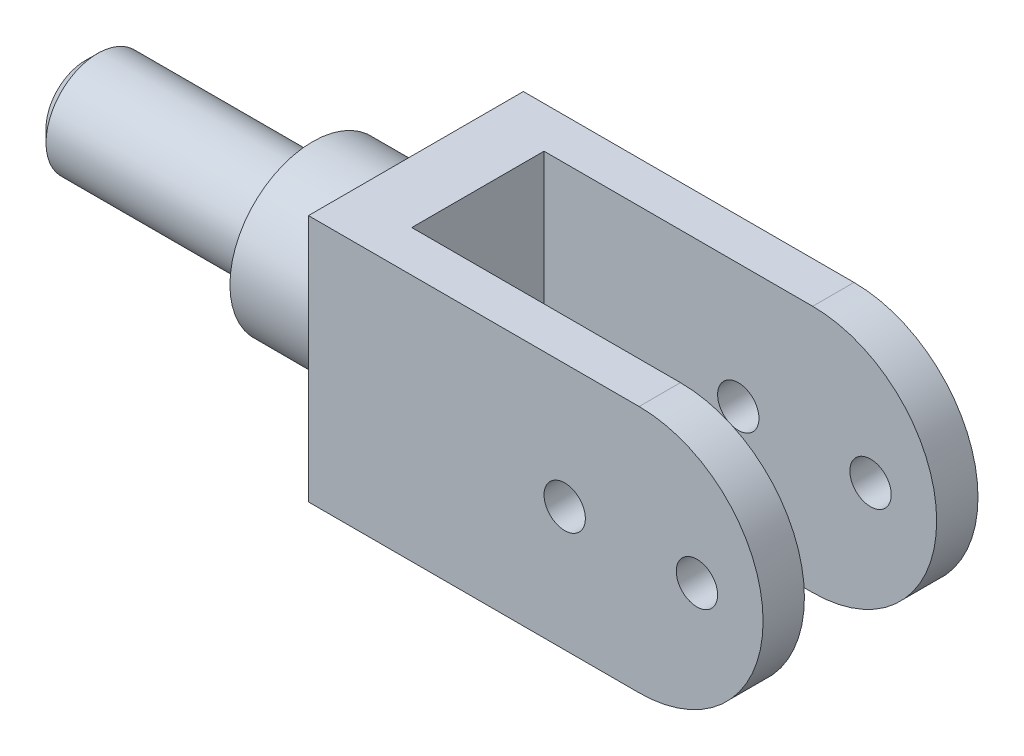
ISO-10303-21;
HEADER;
FILE_DESCRIPTION(('STEP AP214'),'2;1');
FILE_NAME('part.step','',(''),(''),'','','');
FILE_SCHEMA(('AUTOMOTIVE_DESIGN { 1 0 10303 214 1 1 1 1 }'));
ENDSEC;
DATA;
#1=APPLICATION_CONTEXT('core data for automotive mechanical design processes');
#2=APPLICATION_PROTOCOL_DEFINITION('international standard','automotive_design',2000,#1);
#3=PRODUCT_CONTEXT('',#1,'mechanical');
#4=PRODUCT('Part','Part','',(#3));
#5=PRODUCT_RELATED_PRODUCT_CATEGORY('part','',(#4));
#6=PRODUCT_DEFINITION_FORMATION('','',#4);
#7=PRODUCT_DEFINITION_CONTEXT('part definition',#1,'design');
#8=PRODUCT_DEFINITION('design','',#6,#7);
#9=PRODUCT_DEFINITION_SHAPE('','',#8);
#10=(LENGTH_UNIT() NAMED_UNIT(*) SI_UNIT(.MILLI.,.METRE.));
#11=(NAMED_UNIT(*) PLANE_ANGLE_UNIT() SI_UNIT($,.RADIAN.));
#12=(NAMED_UNIT(*) SI_UNIT($,.STERADIAN.) SOLID_ANGLE_UNIT());
#13=UNCERTAINTY_MEASURE_WITH_UNIT(LENGTH_MEASURE(1.E-05),#10,'distance_accuracy_value','');
#14=(GEOMETRIC_REPRESENTATION_CONTEXT(3) GLOBAL_UNCERTAINTY_ASSIGNED_CONTEXT((#13)) GLOBAL_UNIT_ASSIGNED_CONTEXT((#10,
#11,#12)) REPRESENTATION_CONTEXT('',''));
#15=CARTESIAN_POINT('',(0.,0.,0.));
#16=DIRECTION('',(0.,0.,1.));
#17=DIRECTION('',(1.,0.,0.));
#18=AXIS2_PLACEMENT_3D('',#15,#16,#17);
#19=CARTESIAN_POINT('',(0.,60.,-52.));
#20=DIRECTION('',(1.,0.,0.));
#21=DIRECTION('',(0.,0.,-1.));
#22=AXIS2_PLACEMENT_3D('',#19,#20,#21);
#23=PLANE('',#22);
#24=DIRECTION('',(0.,-1.,0.));
#25=VECTOR('',#24,1.);
#26=CARTESIAN_POINT('',(0.,60.,-52.));
#27=LINE('',#26,#25);
#28=CARTESIAN_POINT('',(0.,60.,-52.));
#29=VERTEX_POINT('',#28);
#30=CARTESIAN_POINT('',(0.,30.,-52.));
#31=VERTEX_POINT('',#30);
#32=EDGE_CURVE('E143',#29,#31,#27,.T.);
#33=ORIENTED_EDGE('',*,*,#32,.T.);
#34=CARTESIAN_POINT('',(0.,30.,-26.));
#35=DIRECTION('',(1.,0.,0.));
#36=DIRECTION('',(0.,0.,-1.));
#37=AXIS2_PLACEMENT_3D('',#34,#35,#36);
#38=CIRCLE('',#37,26.);
#39=CARTESIAN_POINT('',(0.,30.,0.));
#40=VERTEX_POINT('',#39);
#41=EDGE_CURVE('E166',#31,#40,#38,.T.);
#42=ORIENTED_EDGE('',*,*,#41,.T.);
#43=DIRECTION('',(0.,-1.,0.));
#44=VECTOR('',#43,1.);
#45=CARTESIAN_POINT('',(0.,60.,0.));
#46=LINE('',#45,#44);
#47=CARTESIAN_POINT('',(0.,60.,0.));
#48=VERTEX_POINT('',#47);
#49=EDGE_CURVE('E154',#48,#40,#46,.T.);
#50=ORIENTED_EDGE('',*,*,#49,.F.);
#51=DIRECTION('',(0.,0.,1.));
#52=VECTOR('',#51,1.);
#53=CARTESIAN_POINT('',(0.,60.,-52.));
#54=LINE('',#53,#52);
#55=EDGE_CURVE('E133',#29,#48,#54,.T.);
#56=ORIENTED_EDGE('',*,*,#55,.F.);
#57=EDGE_LOOP('',(#33,#42,#50,#56));
#58=FACE_BOUND('',#57,.T.);
#59=ADVANCED_FACE('F35',(#58),#23,.F.);
#60=CARTESIAN_POINT('',(0.,0.,0.));
#61=VERTEX_POINT('',#60);
#62=EDGE_CURVE('E153',#40,#61,#46,.T.);
#63=ORIENTED_EDGE('',*,*,#62,.F.);
#64=CARTESIAN_POINT('',(0.,30.,-26.));
#65=DIRECTION('',(1.,0.,0.));
#66=DIRECTION('',(0.,0.,-1.));
#67=AXIS2_PLACEMENT_3D('',#64,#65,#66);
#68=CIRCLE('',#67,26.);
#69=EDGE_CURVE('E51',#40,#31,#68,.T.);
#70=ORIENTED_EDGE('',*,*,#69,.T.);
#71=CARTESIAN_POINT('',(0.,0.,-52.));
#72=VERTEX_POINT('',#71);
#73=EDGE_CURVE('E147',#31,#72,#27,.T.);
#74=ORIENTED_EDGE('',*,*,#73,.T.);
#75=DIRECTION('',(0.,0.,1.));
#76=VECTOR('',#75,1.);
#77=CARTESIAN_POINT('',(0.,0.,-52.));
#78=LINE('',#77,#76);
#79=EDGE_CURVE('E132',#72,#61,#78,.T.);
#80=ORIENTED_EDGE('',*,*,#79,.T.);
#81=EDGE_LOOP('',(#63,#70,#74,#80));
#82=FACE_BOUND('',#81,.T.);
#83=ADVANCED_FACE('F187',(#82),#23,.F.);
#84=CARTESIAN_POINT('',(0.,60.,0.));
#85=DIRECTION('',(0.,0.,-1.));
#86=DIRECTION('',(-1.,0.,0.));
#87=AXIS2_PLACEMENT_3D('',#84,#85,#86);
#88=PLANE('',#87);
#89=CARTESIAN_POINT('',(62.,30.,0.));
#90=DIRECTION('',(0.,0.,-1.));
#91=DIRECTION('',(-1.,0.,0.));
#92=AXIS2_PLACEMENT_3D('',#89,#90,#91);
#93=CIRCLE('',#92,5.00000000000001);
#94=CARTESIAN_POINT('',(57.,30.,0.));
#95=VERTEX_POINT('',#94);
#96=EDGE_CURVE('E260',#95,#95,#93,.T.);
#97=ORIENTED_EDGE('',*,*,#96,.T.);
#98=EDGE_LOOP('',(#97));
#99=FACE_BOUND('',#98,.T.);
#100=CARTESIAN_POINT('',(94.,30.,0.));
#101=DIRECTION('',(0.,0.,-1.));
#102=DIRECTION('',(-1.,0.,0.));
#103=AXIS2_PLACEMENT_3D('',#100,#101,#102);
#104=CIRCLE('',#103,5.00000000000001);
#105=CARTESIAN_POINT('',(89.,30.,0.));
#106=VERTEX_POINT('',#105);
#107=EDGE_CURVE('E257',#106,#106,#104,.T.);
#108=ORIENTED_EDGE('',*,*,#107,.T.);
#109=EDGE_LOOP('',(#108));
#110=FACE_BOUND('',#109,.T.);
#111=DIRECTION('',(1.,0.,0.));
#112=VECTOR('',#111,1.);
#113=CARTESIAN_POINT('',(0.,0.,0.));
#114=LINE('',#113,#112);
#115=CARTESIAN_POINT('',(80.,0.,0.));
#116=VERTEX_POINT('',#115);
#117=EDGE_CURVE('E291',#61,#116,#114,.T.);
#118=ORIENTED_EDGE('',*,*,#117,.T.);
#119=CARTESIAN_POINT('',(80.,30.,0.));
#120=DIRECTION('',(0.,0.,1.));
#121=DIRECTION('',(1.,0.,0.));
#122=AXIS2_PLACEMENT_3D('',#119,#120,#121);
#123=CIRCLE('',#122,30.);
#124=CARTESIAN_POINT('',(80.,60.,0.));
#125=VERTEX_POINT('',#124);
#126=EDGE_CURVE('E117',#116,#125,#123,.T.);
#127=ORIENTED_EDGE('',*,*,#126,.T.);
#128=DIRECTION('',(1.,0.,0.));
#129=VECTOR('',#128,1.);
#130=CARTESIAN_POINT('',(0.,60.,0.));
#131=LINE('',#130,#129);
#132=EDGE_CURVE('E137',#48,#125,#131,.T.);
#133=ORIENTED_EDGE('',*,*,#132,.F.);
#134=ORIENTED_EDGE('',*,*,#49,.T.);
#135=ORIENTED_EDGE('',*,*,#62,.T.);
#136=EDGE_LOOP('',(#118,#127,#133,#134,#135));
#137=FACE_BOUND('',#136,.T.);
#138=ADVANCED_FACE('F193',(#99,#110,#137),#88,.F.);
#139=CARTESIAN_POINT('',(110.,60.,-10.));
#140=DIRECTION('',(0.,0.,1.));
#141=DIRECTION('',(1.,0.,0.));
#142=AXIS2_PLACEMENT_3D('',#139,#140,#141);
#143=PLANE('',#142);
#144=CARTESIAN_POINT('',(62.,30.,-9.99999999999999));
#145=DIRECTION('',(0.,0.,1.));
#146=DIRECTION('',(1.,0.,0.));
#147=AXIS2_PLACEMENT_3D('',#144,#145,#146);
#148=CIRCLE('',#147,5.00000000000001);
#149=CARTESIAN_POINT('',(67.,30.,-9.99999999999999));
#150=VERTEX_POINT('',#149);
#151=EDGE_CURVE('E256',#150,#150,#148,.T.);
#152=ORIENTED_EDGE('',*,*,#151,.T.);
#153=EDGE_LOOP('',(#152));
#154=FACE_BOUND('',#153,.T.);
#155=CARTESIAN_POINT('',(94.,30.,-10.));
#156=DIRECTION('',(0.,0.,1.));
#157=DIRECTION('',(1.,0.,0.));
#158=AXIS2_PLACEMENT_3D('',#155,#156,#157);
#159=CIRCLE('',#158,5.00000000000001);
#160=CARTESIAN_POINT('',(99.,30.,-10.));
#161=VERTEX_POINT('',#160);
#162=EDGE_CURVE('E263',#161,#161,#159,.T.);
#163=ORIENTED_EDGE('',*,*,#162,.T.);
#164=EDGE_LOOP('',(#163));
#165=FACE_BOUND('',#164,.T.);
#166=CARTESIAN_POINT('',(80.,30.,-9.99999999999999));
#167=DIRECTION('',(0.,0.,1.));
#168=DIRECTION('',(1.,0.,0.));
#169=AXIS2_PLACEMENT_3D('',#166,#167,#168);
#170=CIRCLE('',#169,30.);
#171=CARTESIAN_POINT('',(80.,0.,-10.));
#172=VERTEX_POINT('',#171);
#173=CARTESIAN_POINT('',(80.,60.,-10.));
#174=VERTEX_POINT('',#173);
#175=EDGE_CURVE('E278',#172,#174,#170,.T.);
#176=ORIENTED_EDGE('',*,*,#175,.F.);
#177=DIRECTION('',(-1.,0.,0.));
#178=VECTOR('',#177,1.);
#179=CARTESIAN_POINT('',(110.,0.,-10.));
#180=LINE('',#179,#178);
#181=CARTESIAN_POINT('',(15.,0.,-9.99999999999999));
#182=VERTEX_POINT('',#181);
#183=EDGE_CURVE('E294',#172,#182,#180,.T.);
#184=ORIENTED_EDGE('',*,*,#183,.T.);
#185=DIRECTION('',(0.,-1.,0.));
#186=VECTOR('',#185,1.);
#187=CARTESIAN_POINT('',(15.,60.,-9.99999999999999));
#188=LINE('',#187,#186);
#189=CARTESIAN_POINT('',(15.,60.,-9.99999999999999));
#190=VERTEX_POINT('',#189);
#191=EDGE_CURVE('E150',#190,#182,#188,.T.);
#192=ORIENTED_EDGE('',*,*,#191,.F.);
#193=DIRECTION('',(-1.,0.,0.));
#194=VECTOR('',#193,1.);
#195=CARTESIAN_POINT('',(110.,60.,-10.));
#196=LINE('',#195,#194);
#197=EDGE_CURVE('E282',#174,#190,#196,.T.);
#198=ORIENTED_EDGE('',*,*,#197,.F.);
#199=EDGE_LOOP('',(#176,#184,#192,#198));
#200=FACE_BOUND('',#199,.T.);
#201=ADVANCED_FACE('F197',(#154,#165,#200),#143,.F.);
#202=CARTESIAN_POINT('',(110.,60.,-42.));
#203=DIRECTION('',(0.,0.,-1.));
#204=DIRECTION('',(-1.,0.,0.));
#205=AXIS2_PLACEMENT_3D('',#202,#203,#204);
#206=PLANE('',#205);
#207=CARTESIAN_POINT('',(62.,30.,-42.));
#208=DIRECTION('',(0.,0.,-1.));
#209=DIRECTION('',(-1.,0.,0.));
#210=AXIS2_PLACEMENT_3D('',#207,#208,#209);
#211=CIRCLE('',#210,5.00000000000001);
#212=CARTESIAN_POINT('',(57.,30.,-42.));
#213=VERTEX_POINT('',#212);
#214=EDGE_CURVE('E255',#213,#213,#211,.T.);
#215=ORIENTED_EDGE('',*,*,#214,.T.);
#216=EDGE_LOOP('',(#215));
#217=FACE_BOUND('',#216,.T.);
#218=CARTESIAN_POINT('',(94.,30.,-42.));
#219=DIRECTION('',(0.,0.,-1.));
#220=DIRECTION('',(-1.,0.,0.));
#221=AXIS2_PLACEMENT_3D('',#218,#219,#220);
#222=CIRCLE('',#221,5.00000000000001);
#223=CARTESIAN_POINT('',(89.,30.,-42.));
#224=VERTEX_POINT('',#223);
#225=EDGE_CURVE('E322',#224,#224,#222,.T.);
#226=ORIENTED_EDGE('',*,*,#225,.T.);
#227=EDGE_LOOP('',(#226));
#228=FACE_BOUND('',#227,.T.);
#229=DIRECTION('',(1.,0.,0.));
#230=VECTOR('',#229,1.);
#231=CARTESIAN_POINT('',(110.,0.,-42.));
#232=LINE('',#231,#230);
#233=CARTESIAN_POINT('',(15.,0.,-42.));
#234=VERTEX_POINT('',#233);
#235=CARTESIAN_POINT('',(80.,0.,-42.));
#236=VERTEX_POINT('',#235);
#237=EDGE_CURVE('E134',#234,#236,#232,.T.);
#238=ORIENTED_EDGE('',*,*,#237,.T.);
#239=CARTESIAN_POINT('',(80.,30.,-42.));
#240=DIRECTION('',(0.,0.,-1.));
#241=DIRECTION('',(-1.,0.,0.));
#242=AXIS2_PLACEMENT_3D('',#239,#240,#241);
#243=CIRCLE('',#242,30.);
#244=CARTESIAN_POINT('',(80.,60.,-42.));
#245=VERTEX_POINT('',#244);
#246=EDGE_CURVE('E123',#245,#236,#243,.T.);
#247=ORIENTED_EDGE('',*,*,#246,.F.);
#248=DIRECTION('',(1.,0.,0.));
#249=VECTOR('',#248,1.);
#250=CARTESIAN_POINT('',(110.,60.,-42.));
#251=LINE('',#250,#249);
#252=CARTESIAN_POINT('',(15.,60.,-42.));
#253=VERTEX_POINT('',#252);
#254=EDGE_CURVE('E286',#253,#245,#251,.T.);
#255=ORIENTED_EDGE('',*,*,#254,.F.);
#256=DIRECTION('',(0.,-1.,0.));
#257=VECTOR('',#256,1.);
#258=CARTESIAN_POINT('',(15.,60.,-42.));
#259=LINE('',#258,#257);
#260=EDGE_CURVE('E146',#253,#234,#259,.T.);
#261=ORIENTED_EDGE('',*,*,#260,.T.);
#262=EDGE_LOOP('',(#238,#247,#255,#261));
#263=FACE_BOUND('',#262,.T.);
#264=ADVANCED_FACE('F201',(#217,#228,#263),#206,.F.);
#265=CARTESIAN_POINT('',(0.,60.,-52.));
#266=DIRECTION('',(0.,0.,1.));
#267=DIRECTION('',(1.,0.,0.));
#268=AXIS2_PLACEMENT_3D('',#265,#266,#267);
#269=PLANE('',#268);
#270=CARTESIAN_POINT('',(62.,30.,-52.));
#271=DIRECTION('',(0.,0.,1.));
#272=DIRECTION('',(1.,0.,0.));
#273=AXIS2_PLACEMENT_3D('',#270,#271,#272);
#274=CIRCLE('',#273,5.00000000000001);
#275=CARTESIAN_POINT('',(67.,30.,-52.));
#276=VERTEX_POINT('',#275);
#277=EDGE_CURVE('E252',#276,#276,#274,.T.);
#278=ORIENTED_EDGE('',*,*,#277,.T.);
#279=EDGE_LOOP('',(#278));
#280=FACE_BOUND('',#279,.T.);
#281=CARTESIAN_POINT('',(94.,30.,-52.));
#282=DIRECTION('',(0.,0.,1.));
#283=DIRECTION('',(1.,0.,0.));
#284=AXIS2_PLACEMENT_3D('',#281,#282,#283);
#285=CIRCLE('',#284,5.00000000000001);
#286=CARTESIAN_POINT('',(99.,30.,-52.));
#287=VERTEX_POINT('',#286);
#288=EDGE_CURVE('E325',#287,#287,#285,.T.);
#289=ORIENTED_EDGE('',*,*,#288,.T.);
#290=EDGE_LOOP('',(#289));
#291=FACE_BOUND('',#290,.T.);
#292=CARTESIAN_POINT('',(80.,30.,-52.));
#293=DIRECTION('',(0.,0.,1.));
#294=DIRECTION('',(1.,0.,0.));
#295=AXIS2_PLACEMENT_3D('',#292,#293,#294);
#296=CIRCLE('',#295,30.);
#297=CARTESIAN_POINT('',(80.,0.,-52.));
#298=VERTEX_POINT('',#297);
#299=CARTESIAN_POINT('',(80.,60.,-52.));
#300=VERTEX_POINT('',#299);
#301=EDGE_CURVE('E106',#298,#300,#296,.T.);
#302=ORIENTED_EDGE('',*,*,#301,.F.);
#303=DIRECTION('',(-1.,0.,0.));
#304=VECTOR('',#303,1.);
#305=CARTESIAN_POINT('',(0.,0.,-52.));
#306=LINE('',#305,#304);
#307=EDGE_CURVE('E110',#298,#72,#306,.T.);
#308=ORIENTED_EDGE('',*,*,#307,.T.);
#309=ORIENTED_EDGE('',*,*,#73,.F.);
#310=ORIENTED_EDGE('',*,*,#32,.F.);
#311=DIRECTION('',(-1.,0.,0.));
#312=VECTOR('',#311,1.);
#313=CARTESIAN_POINT('',(0.,60.,-52.));
#314=LINE('',#313,#312);
#315=EDGE_CURVE('E113',#300,#29,#314,.T.);
#316=ORIENTED_EDGE('',*,*,#315,.F.);
#317=EDGE_LOOP('',(#302,#308,#309,#310,#316));
#318=FACE_BOUND('',#317,.T.);
#319=ADVANCED_FACE('F108',(#280,#291,#318),#269,.F.);
#320=CARTESIAN_POINT('',(15.,60.,-42.));
#321=DIRECTION('',(-1.,0.,0.));
#322=DIRECTION('',(0.,0.,1.));
#323=AXIS2_PLACEMENT_3D('',#320,#321,#322);
#324=PLANE('',#323);
#325=DIRECTION('',(0.,0.,-1.));
#326=VECTOR('',#325,1.);
#327=CARTESIAN_POINT('',(15.,0.,-42.));
#328=LINE('',#327,#326);
#329=EDGE_CURVE('E139',#182,#234,#328,.T.);
#330=ORIENTED_EDGE('',*,*,#329,.T.);
#331=ORIENTED_EDGE('',*,*,#260,.F.);
#332=DIRECTION('',(0.,0.,-1.));
#333=VECTOR('',#332,1.);
#334=CARTESIAN_POINT('',(15.,60.,-42.));
#335=LINE('',#334,#333);
#336=EDGE_CURVE('E284',#190,#253,#335,.T.);
#337=ORIENTED_EDGE('',*,*,#336,.F.);
#338=ORIENTED_EDGE('',*,*,#191,.T.);
#339=EDGE_LOOP('',(#330,#331,#337,#338));
#340=FACE_BOUND('',#339,.T.);
#341=ADVANCED_FACE('F203',(#340),#324,.F.);
#342=CARTESIAN_POINT('',(0.,60.,0.));
#343=DIRECTION('',(0.,1.,0.));
#344=DIRECTION('',(0.,0.,1.));
#345=AXIS2_PLACEMENT_3D('',#342,#343,#344);
#346=PLANE('',#345);
#347=DIRECTION('',(0.,0.,1.));
#348=VECTOR('',#347,1.);
#349=CARTESIAN_POINT('',(80.,60.,-52.));
#350=LINE('',#349,#348);
#351=EDGE_CURVE('E116',#300,#245,#350,.T.);
#352=ORIENTED_EDGE('',*,*,#351,.F.);
#353=ORIENTED_EDGE('',*,*,#315,.T.);
#354=ORIENTED_EDGE('',*,*,#55,.T.);
#355=ORIENTED_EDGE('',*,*,#132,.T.);
#356=DIRECTION('',(0.,0.,1.));
#357=VECTOR('',#356,1.);
#358=CARTESIAN_POINT('',(80.,60.,-52.));
#359=LINE('',#358,#357);
#360=EDGE_CURVE('E157',#174,#125,#359,.T.);
#361=ORIENTED_EDGE('',*,*,#360,.F.);
#362=ORIENTED_EDGE('',*,*,#197,.T.);
#363=ORIENTED_EDGE('',*,*,#336,.T.);
#364=ORIENTED_EDGE('',*,*,#254,.T.);
#365=EDGE_LOOP('',(#352,#353,#354,#355,#361,#362,#363,#364));
#366=FACE_BOUND('',#365,.T.);
#367=ADVANCED_FACE('F206',(#366),#346,.T.);
#368=CARTESIAN_POINT('',(0.,0.,0.));
#369=DIRECTION('',(0.,1.,0.));
#370=DIRECTION('',(0.,0.,1.));
#371=AXIS2_PLACEMENT_3D('',#368,#369,#370);
#372=PLANE('',#371);
#373=ORIENTED_EDGE('',*,*,#307,.F.);
#374=DIRECTION('',(0.,0.,1.));
#375=VECTOR('',#374,1.);
#376=CARTESIAN_POINT('',(80.,0.,-52.));
#377=LINE('',#376,#375);
#378=EDGE_CURVE('E120',#298,#236,#377,.T.);
#379=ORIENTED_EDGE('',*,*,#378,.T.);
#380=ORIENTED_EDGE('',*,*,#237,.F.);
#381=ORIENTED_EDGE('',*,*,#329,.F.);
#382=ORIENTED_EDGE('',*,*,#183,.F.);
#383=DIRECTION('',(0.,0.,1.));
#384=VECTOR('',#383,1.);
#385=CARTESIAN_POINT('',(80.,0.,-52.));
#386=LINE('',#385,#384);
#387=EDGE_CURVE('E159',#172,#116,#386,.T.);
#388=ORIENTED_EDGE('',*,*,#387,.T.);
#389=ORIENTED_EDGE('',*,*,#117,.F.);
#390=ORIENTED_EDGE('',*,*,#79,.F.);
#391=EDGE_LOOP('',(#373,#379,#380,#381,#382,#388,#389,#390));
#392=FACE_BOUND('',#391,.T.);
#393=ADVANCED_FACE('F129',(#392),#372,.F.);
#394=CARTESIAN_POINT('',(80.,30.,-52.));
#395=DIRECTION('',(0.,0.,1.));
#396=DIRECTION('',(1.,0.,0.));
#397=AXIS2_PLACEMENT_3D('',#394,#395,#396);
#398=CYLINDRICAL_SURFACE('',#397,30.);
#399=ORIENTED_EDGE('',*,*,#175,.T.);
#400=ORIENTED_EDGE('',*,*,#360,.T.);
#401=ORIENTED_EDGE('',*,*,#126,.F.);
#402=ORIENTED_EDGE('',*,*,#387,.F.);
#403=EDGE_LOOP('',(#399,#400,#401,#402));
#404=FACE_BOUND('',#403,.T.);
#405=ADVANCED_FACE('F216',(#404),#398,.T.);
#406=ORIENTED_EDGE('',*,*,#246,.T.);
#407=ORIENTED_EDGE('',*,*,#378,.F.);
#408=ORIENTED_EDGE('',*,*,#301,.T.);
#409=ORIENTED_EDGE('',*,*,#351,.T.);
#410=EDGE_LOOP('',(#406,#407,#408,#409));
#411=FACE_BOUND('',#410,.T.);
#412=ADVANCED_FACE('F121',(#411),#398,.T.);
#413=CARTESIAN_POINT('',(-25.,30.,-26.));
#414=DIRECTION('',(-1.,0.,0.));
#415=DIRECTION('',(0.,0.,1.));
#416=AXIS2_PLACEMENT_3D('',#413,#414,#415);
#417=PLANE('',#416);
#418=CARTESIAN_POINT('',(-25.,30.,-26.));
#419=DIRECTION('',(-1.,0.,0.));
#420=DIRECTION('',(0.,0.,1.));
#421=AXIS2_PLACEMENT_3D('',#418,#419,#420);
#422=CIRCLE('',#421,20.);
#423=CARTESIAN_POINT('',(-25.,30.,-5.99999999999998));
#424=VERTEX_POINT('',#423);
#425=EDGE_CURVE('E127',#424,#424,#422,.T.);
#426=ORIENTED_EDGE('',*,*,#425,.T.);
#427=EDGE_LOOP('',(#426));
#428=FACE_BOUND('',#427,.T.);
#429=CARTESIAN_POINT('',(-25.,30.,-26.));
#430=DIRECTION('',(-1.,0.,0.));
#431=DIRECTION('',(0.,0.,1.));
#432=AXIS2_PLACEMENT_3D('',#429,#430,#431);
#433=CIRCLE('',#432,12.5);
#434=CARTESIAN_POINT('',(-25.,30.,-13.5));
#435=VERTEX_POINT('',#434);
#436=EDGE_CURVE('E269',#435,#435,#433,.T.);
#437=ORIENTED_EDGE('',*,*,#436,.F.);
#438=EDGE_LOOP('',(#437));
#439=FACE_BOUND('',#438,.T.);
#440=ADVANCED_FACE('F231',(#428,#439),#417,.T.);
#441=CARTESIAN_POINT('',(-25.,30.,-26.));
#442=DIRECTION('',(1.,0.,0.));
#443=DIRECTION('',(0.,0.,-1.));
#444=AXIS2_PLACEMENT_3D('',#441,#442,#443);
#445=CYLINDRICAL_SURFACE('',#444,20.);
#446=CARTESIAN_POINT('',(-6.00000000000001,30.,-26.));
#447=DIRECTION('',(1.,0.,0.));
#448=DIRECTION('',(0.,0.,-1.));
#449=AXIS2_PLACEMENT_3D('',#446,#447,#448);
#450=CIRCLE('',#449,20.);
#451=CARTESIAN_POINT('',(-6.00000000000002,30.,-46.));
#452=VERTEX_POINT('',#451);
#453=EDGE_CURVE('E162',#452,#452,#450,.F.);
#454=ORIENTED_EDGE('',*,*,#453,.T.);
#455=EDGE_LOOP('',(#454));
#456=FACE_BOUND('',#455,.T.);
#457=ORIENTED_EDGE('',*,*,#425,.F.);
#458=EDGE_LOOP('',(#457));
#459=FACE_BOUND('',#458,.T.);
#460=ADVANCED_FACE('F228',(#456,#459),#445,.T.);
#461=CARTESIAN_POINT('',(-80.,0.,0.));
#462=DIRECTION('',(-1.,0.,0.));
#463=DIRECTION('',(0.,0.,1.));
#464=AXIS2_PLACEMENT_3D('',#461,#462,#463);
#465=PLANE('',#464);
#466=CARTESIAN_POINT('',(-80.,30.,-26.));
#467=DIRECTION('',(-1.,0.,0.));
#468=DIRECTION('',(0.,0.,1.));
#469=AXIS2_PLACEMENT_3D('',#466,#467,#468);
#470=CIRCLE('',#469,9.49999999999992);
#471=CARTESIAN_POINT('',(-80.,30.,-16.5));
#472=VERTEX_POINT('',#471);
#473=EDGE_CURVE('E44',#472,#472,#470,.T.);
#474=ORIENTED_EDGE('',*,*,#473,.T.);
#475=EDGE_LOOP('',(#474));
#476=FACE_BOUND('',#475,.T.);
#477=ADVANCED_FACE('F170',(#476),#465,.T.);
#478=CARTESIAN_POINT('',(-80.,30.,-26.));
#479=DIRECTION('',(1.,0.,0.));
#480=DIRECTION('',(0.,0.,-1.));
#481=AXIS2_PLACEMENT_3D('',#478,#479,#480);
#482=CYLINDRICAL_SURFACE('',#481,12.5);
#483=CARTESIAN_POINT('',(-76.9999999999999,30.,-26.));
#484=DIRECTION('',(-1.,0.,0.));
#485=DIRECTION('',(0.,0.,1.));
#486=AXIS2_PLACEMENT_3D('',#483,#484,#485);
#487=CIRCLE('',#486,12.5);
#488=CARTESIAN_POINT('',(-76.9999999999999,30.,-13.5));
#489=VERTEX_POINT('',#488);
#490=EDGE_CURVE('E11',#489,#489,#487,.F.);
#491=ORIENTED_EDGE('',*,*,#490,.T.);
#492=EDGE_LOOP('',(#491));
#493=FACE_BOUND('',#492,.T.);
#494=ORIENTED_EDGE('',*,*,#436,.T.);
#495=EDGE_LOOP('',(#494));
#496=FACE_BOUND('',#495,.T.);
#497=ADVANCED_FACE('F184',(#493,#496),#482,.T.);
#498=CARTESIAN_POINT('',(-6.00000000000001,30.,-26.));
#499=DIRECTION('',(1.,0.,0.));
#500=DIRECTION('',(0.,0.,-1.));
#501=AXIS2_PLACEMENT_3D('',#498,#499,#500);
#502=TOROIDAL_SURFACE('',#501,26.,6.);
#503=ORIENTED_EDGE('',*,*,#69,.F.);
#504=ORIENTED_EDGE('',*,*,#41,.F.);
#505=EDGE_LOOP('',(#503,#504));
#506=FACE_BOUND('',#505,.T.);
#507=ORIENTED_EDGE('',*,*,#453,.F.);
#508=EDGE_LOOP('',(#507));
#509=FACE_BOUND('',#508,.T.);
#510=ADVANCED_FACE('F174',(#506,#509),#502,.F.);
#511=CARTESIAN_POINT('',(-80.,30.,-26.));
#512=DIRECTION('',(1.,0.,0.));
#513=DIRECTION('',(0.,0.,-1.));
#514=AXIS2_PLACEMENT_3D('',#511,#512,#513);
#515=CONICAL_SURFACE('',#514,9.49999999999991,0.785398163397446);
#516=ORIENTED_EDGE('',*,*,#490,.F.);
#517=EDGE_LOOP('',(#516));
#518=FACE_BOUND('',#517,.T.);
#519=ORIENTED_EDGE('',*,*,#473,.F.);
#520=EDGE_LOOP('',(#519));
#521=FACE_BOUND('',#520,.T.);
#522=ADVANCED_FACE('F38',(#518,#521),#515,.T.);
#523=CARTESIAN_POINT('',(94.,30.,-52.));
#524=DIRECTION('',(0.,0.,1.));
#525=DIRECTION('',(1.,0.,0.));
#526=AXIS2_PLACEMENT_3D('',#523,#524,#525);
#527=CYLINDRICAL_SURFACE('',#526,5.00000000000001);
#528=ORIENTED_EDGE('',*,*,#288,.F.);
#529=EDGE_LOOP('',(#528));
#530=FACE_BOUND('',#529,.T.);
#531=ORIENTED_EDGE('',*,*,#225,.F.);
#532=EDGE_LOOP('',(#531));
#533=FACE_BOUND('',#532,.T.);
#534=ADVANCED_FACE('F173',(#530,#533),#527,.F.);
#535=CARTESIAN_POINT('',(62.,30.,-52.));
#536=DIRECTION('',(0.,0.,1.));
#537=DIRECTION('',(1.,0.,0.));
#538=AXIS2_PLACEMENT_3D('',#535,#536,#537);
#539=CYLINDRICAL_SURFACE('',#538,5.00000000000001);
#540=ORIENTED_EDGE('',*,*,#277,.F.);
#541=EDGE_LOOP('',(#540));
#542=FACE_BOUND('',#541,.T.);
#543=ORIENTED_EDGE('',*,*,#214,.F.);
#544=EDGE_LOOP('',(#543));
#545=FACE_BOUND('',#544,.T.);
#546=ADVANCED_FACE('F180',(#542,#545),#539,.F.);
#547=ORIENTED_EDGE('',*,*,#162,.F.);
#548=EDGE_LOOP('',(#547));
#549=FACE_BOUND('',#548,.T.);
#550=ORIENTED_EDGE('',*,*,#107,.F.);
#551=EDGE_LOOP('',(#550));
#552=FACE_BOUND('',#551,.T.);
#553=ADVANCED_FACE('F183',(#549,#552),#527,.F.);
#554=ORIENTED_EDGE('',*,*,#151,.F.);
#555=EDGE_LOOP('',(#554));
#556=FACE_BOUND('',#555,.T.);
#557=ORIENTED_EDGE('',*,*,#96,.F.);
#558=EDGE_LOOP('',(#557));
#559=FACE_BOUND('',#558,.T.);
#560=ADVANCED_FACE('F237',(#556,#559),#539,.F.);
#561=CLOSED_SHELL('',(#59,#83,#138,#201,#264,#319,#341,#367,#393,#405,#412,#440,#460,#477,#497,
#510,#522,#534,#546,#553,#560));
#562=MANIFOLD_SOLID_BREP('B2',#561);
#563=ADVANCED_BREP_SHAPE_REPRESENTATION('',(#18,#562),#14);
#564=SHAPE_DEFINITION_REPRESENTATION(#9,#563);
ENDSEC;
END-ISO-10303-21;
